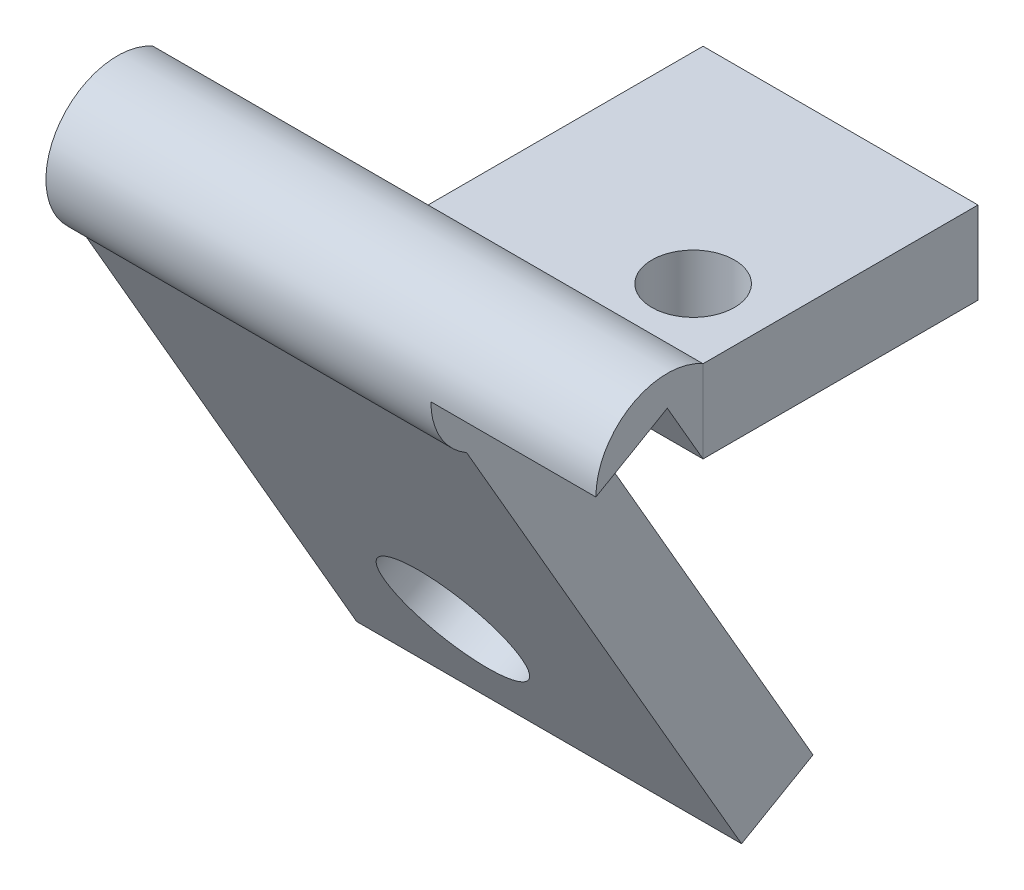
ISO-10303-21;
HEADER;
FILE_DESCRIPTION(('STEP AP214'),'2;1');
FILE_NAME('part.step','',(''),(''),'','','');
FILE_SCHEMA(('AUTOMOTIVE_DESIGN { 1 0 10303 214 1 1 1 1 }'));
ENDSEC;
DATA;
#1=APPLICATION_CONTEXT('core data for automotive mechanical design processes');
#2=APPLICATION_PROTOCOL_DEFINITION('international standard','automotive_design',2000,#1);
#3=PRODUCT_CONTEXT('',#1,'mechanical');
#4=PRODUCT('Part','Part','',(#3));
#5=PRODUCT_RELATED_PRODUCT_CATEGORY('part','',(#4));
#6=PRODUCT_DEFINITION_FORMATION('','',#4);
#7=PRODUCT_DEFINITION_CONTEXT('part definition',#1,'design');
#8=PRODUCT_DEFINITION('design','',#6,#7);
#9=PRODUCT_DEFINITION_SHAPE('','',#8);
#10=(LENGTH_UNIT() NAMED_UNIT(*) SI_UNIT(.MILLI.,.METRE.));
#11=(NAMED_UNIT(*) PLANE_ANGLE_UNIT() SI_UNIT($,.RADIAN.));
#12=(NAMED_UNIT(*) SI_UNIT($,.STERADIAN.) SOLID_ANGLE_UNIT());
#13=UNCERTAINTY_MEASURE_WITH_UNIT(LENGTH_MEASURE(1.E-05),#10,'distance_accuracy_value','');
#14=(GEOMETRIC_REPRESENTATION_CONTEXT(3) GLOBAL_UNCERTAINTY_ASSIGNED_CONTEXT((#13)) GLOBAL_UNIT_ASSIGNED_CONTEXT((#10,
#11,#12)) REPRESENTATION_CONTEXT('',''));
#15=CARTESIAN_POINT('',(0.,0.,0.));
#16=DIRECTION('',(0.,0.,1.));
#17=DIRECTION('',(1.,0.,0.));
#18=AXIS2_PLACEMENT_3D('',#15,#16,#17);
#19=CARTESIAN_POINT('',(-14.36,0.,7.22999999999998));
#20=DIRECTION('',(0.,0.,1.));
#21=DIRECTION('',(1.,0.,0.));
#22=AXIS2_PLACEMENT_3D('',#19,#20,#21);
#23=PLANE('',#22);
#24=DIRECTION('',(0.,-1.,0.));
#25=VECTOR('',#24,1.);
#26=CARTESIAN_POINT('',(5.63999999999998,0.,7.22999999999998));
#27=LINE('',#26,#25);
#28=CARTESIAN_POINT('',(5.63999999999998,3.,7.22999999999998));
#29=VERTEX_POINT('',#28);
#30=CARTESIAN_POINT('',(5.63999999999998,0.,7.22999999999998));
#31=VERTEX_POINT('',#30);
#32=EDGE_CURVE('E139',#29,#31,#27,.T.);
#33=ORIENTED_EDGE('',*,*,#32,.T.);
#34=DIRECTION('',(1.,0.,0.));
#35=VECTOR('',#34,1.);
#36=CARTESIAN_POINT('',(-14.36,0.,7.22999999999998));
#37=LINE('',#36,#35);
#38=CARTESIAN_POINT('',(-0.360000000000018,0.,7.22999999999998));
#39=VERTEX_POINT('',#38);
#40=EDGE_CURVE('E169',#39,#31,#37,.T.);
#41=ORIENTED_EDGE('',*,*,#40,.F.);
#42=DIRECTION('',(1.,0.,0.));
#43=VECTOR('',#42,1.);
#44=CARTESIAN_POINT('',(-14.36,0.,7.22999999999998));
#45=LINE('',#44,#43);
#46=CARTESIAN_POINT('',(-14.36,0.,7.22999999999998));
#47=VERTEX_POINT('',#46);
#48=EDGE_CURVE('E145',#47,#39,#45,.T.);
#49=ORIENTED_EDGE('',*,*,#48,.F.);
#50=DIRECTION('',(0.,-1.,0.));
#51=VECTOR('',#50,1.);
#52=CARTESIAN_POINT('',(-14.36,0.,7.22999999999998));
#53=LINE('',#52,#51);
#54=CARTESIAN_POINT('',(-14.36,3.,7.22999999999998));
#55=VERTEX_POINT('',#54);
#56=EDGE_CURVE('E134',#55,#47,#53,.T.);
#57=ORIENTED_EDGE('',*,*,#56,.F.);
#58=DIRECTION('',(1.,0.,0.));
#59=VECTOR('',#58,1.);
#60=CARTESIAN_POINT('',(-14.36,3.,7.22999999999998));
#61=LINE('',#60,#59);
#62=EDGE_CURVE('E86',#55,#29,#61,.T.);
#63=ORIENTED_EDGE('',*,*,#62,.T.);
#64=EDGE_LOOP('',(#33,#41,#49,#57,#63));
#65=FACE_BOUND('',#64,.T.);
#66=ADVANCED_FACE('F58',(#65),#23,.F.);
#67=CARTESIAN_POINT('',(-14.36,-3.13068183468073,5.4225));
#68=DIRECTION('',(0.,-0.499999999999998,0.86602540378444));
#69=DIRECTION('',(0.,-0.86602540378444,-0.499999999999998));
#70=AXIS2_PLACEMENT_3D('',#67,#68,#69);
#71=PLANE('',#70);
#72=CARTESIAN_POINT('',(-8.36000000000002,-12.9903810567666,-0.269999999999973));
#73=DIRECTION('',(0.,0.499999999999998,-0.86602540378444));
#74=DIRECTION('',(0.,0.86602540378444,0.499999999999998));
#75=AXIS2_PLACEMENT_3D('',#72,#73,#74);
#76=CIRCLE('',#75,2.5);
#77=CARTESIAN_POINT('',(-8.36000000000002,-10.8253175473055,0.980000000000023));
#78=VERTEX_POINT('',#77);
#79=EDGE_CURVE('E151',#78,#78,#76,.T.);
#80=ORIENTED_EDGE('',*,*,#79,.F.);
#81=EDGE_LOOP('',(#80));
#82=FACE_BOUND('',#81,.T.);
#83=ORIENTED_EDGE('',*,*,#48,.T.);
#84=DIRECTION('',(0.,0.86602540378444,0.499999999999998));
#85=VECTOR('',#84,1.);
#86=CARTESIAN_POINT('',(-0.360000000000018,-17.3205080756888,-2.76999999999996));
#87=LINE('',#86,#85);
#88=CARTESIAN_POINT('',(-0.360000000000018,-17.3205080756888,-2.76999999999996));
#89=VERTEX_POINT('',#88);
#90=EDGE_CURVE('E186',#89,#39,#87,.T.);
#91=ORIENTED_EDGE('',*,*,#90,.F.);
#92=DIRECTION('',(1.,0.,0.));
#93=VECTOR('',#92,1.);
#94=CARTESIAN_POINT('',(-14.36,-17.3205080756888,-2.76999999999996));
#95=LINE('',#94,#93);
#96=CARTESIAN_POINT('',(-14.36,-17.3205080756888,-2.76999999999996));
#97=VERTEX_POINT('',#96);
#98=EDGE_CURVE('E126',#97,#89,#95,.T.);
#99=ORIENTED_EDGE('',*,*,#98,.F.);
#100=DIRECTION('',(0.,-0.86602540378444,-0.499999999999998));
#101=VECTOR('',#100,1.);
#102=CARTESIAN_POINT('',(-14.36,-3.13068183468073,5.4225));
#103=LINE('',#102,#101);
#104=EDGE_CURVE('E74',#47,#97,#103,.T.);
#105=ORIENTED_EDGE('',*,*,#104,.F.);
#106=EDGE_LOOP('',(#83,#91,#99,#105));
#107=FACE_BOUND('',#106,.T.);
#108=ADVANCED_FACE('F183',(#82,#107),#71,.F.);
#109=CARTESIAN_POINT('',(-14.36,-14.1898262410081,-8.19249999999996));
#110=DIRECTION('',(0.,0.86602540378444,0.499999999999997));
#111=DIRECTION('',(0.,-0.499999999999997,0.86602540378444));
#112=AXIS2_PLACEMENT_3D('',#109,#110,#111);
#113=PLANE('',#112);
#114=ORIENTED_EDGE('',*,*,#98,.T.);
#115=DIRECTION('',(0.,0.499999999999998,-0.86602540378444));
#116=VECTOR('',#115,1.);
#117=CARTESIAN_POINT('',(-0.360000000000018,-22.3205080756887,5.89025403784444));
#118=LINE('',#117,#116);
#119=CARTESIAN_POINT('',(-0.360000000000018,-18.8205080756888,-0.171923788646639));
#120=VERTEX_POINT('',#119);
#121=EDGE_CURVE('E124',#120,#89,#118,.T.);
#122=ORIENTED_EDGE('',*,*,#121,.F.);
#123=DIRECTION('',(1.,0.,0.));
#124=VECTOR('',#123,1.);
#125=CARTESIAN_POINT('',(-14.36,-18.8205080756888,-0.171923788646644));
#126=LINE('',#125,#124);
#127=CARTESIAN_POINT('',(-14.36,-18.8205080756888,-0.171923788646644));
#128=VERTEX_POINT('',#127);
#129=EDGE_CURVE('E120',#128,#120,#126,.T.);
#130=ORIENTED_EDGE('',*,*,#129,.F.);
#131=DIRECTION('',(0.,-0.499999999999997,0.86602540378444));
#132=VECTOR('',#131,1.);
#133=CARTESIAN_POINT('',(-14.36,-14.1898262410081,-8.19249999999996));
#134=LINE('',#133,#132);
#135=EDGE_CURVE('E108',#97,#128,#134,.T.);
#136=ORIENTED_EDGE('',*,*,#135,.F.);
#137=EDGE_LOOP('',(#114,#122,#130,#136));
#138=FACE_BOUND('',#137,.T.);
#139=ADVANCED_FACE('F121',(#138),#113,.F.);
#140=CARTESIAN_POINT('',(-14.36,-4.63068183468072,8.02057621135332));
#141=DIRECTION('',(0.,0.499999999999998,-0.86602540378444));
#142=DIRECTION('',(0.,0.86602540378444,0.499999999999998));
#143=AXIS2_PLACEMENT_3D('',#140,#141,#142);
#144=PLANE('',#143);
#145=CARTESIAN_POINT('',(-8.36000000000002,-14.4903810567666,2.32807621135335));
#146=DIRECTION('',(0.,0.499999999999998,-0.86602540378444));
#147=DIRECTION('',(0.,0.86602540378444,0.499999999999998));
#148=AXIS2_PLACEMENT_3D('',#145,#146,#147);
#149=CIRCLE('',#148,2.5);
#150=CARTESIAN_POINT('',(-8.36000000000002,-12.3253175473055,3.57807621135334));
#151=VERTEX_POINT('',#150);
#152=EDGE_CURVE('E142',#151,#151,#149,.T.);
#153=ORIENTED_EDGE('',*,*,#152,.T.);
#154=EDGE_LOOP('',(#153));
#155=FACE_BOUND('',#154,.T.);
#156=ORIENTED_EDGE('',*,*,#129,.T.);
#157=DIRECTION('',(0.,0.86602540378444,0.499999999999998));
#158=VECTOR('',#157,1.);
#159=CARTESIAN_POINT('',(-0.360000000000018,-4.63068183468072,8.02057621135332));
#160=LINE('',#159,#158);
#161=CARTESIAN_POINT('',(-0.360000000000018,-1.49999999999996,9.82807621135333));
#162=VERTEX_POINT('',#161);
#163=EDGE_CURVE('E168',#120,#162,#160,.T.);
#164=ORIENTED_EDGE('',*,*,#163,.T.);
#165=DIRECTION('',(1.,0.,0.));
#166=VECTOR('',#165,1.);
#167=CARTESIAN_POINT('',(-14.36,-1.49999999999995,9.82807621135332));
#168=LINE('',#167,#166);
#169=CARTESIAN_POINT('',(-14.36,-1.49999999999995,9.82807621135332));
#170=VERTEX_POINT('',#169);
#171=EDGE_CURVE('E127',#170,#162,#168,.T.);
#172=ORIENTED_EDGE('',*,*,#171,.F.);
#173=DIRECTION('',(0.,0.86602540378444,0.499999999999998));
#174=VECTOR('',#173,1.);
#175=CARTESIAN_POINT('',(-14.36,-4.63068183468072,8.02057621135332));
#176=LINE('',#175,#174);
#177=EDGE_CURVE('E113',#128,#170,#176,.T.);
#178=ORIENTED_EDGE('',*,*,#177,.F.);
#179=EDGE_LOOP('',(#156,#164,#172,#178));
#180=FACE_BOUND('',#179,.T.);
#181=ADVANCED_FACE('F129',(#155,#180),#144,.F.);
#182=CARTESIAN_POINT('',(-14.36,0.750000000000003,8.52903810567664));
#183=DIRECTION('',(1.,0.,0.));
#184=DIRECTION('',(0.,0.,-1.));
#185=AXIS2_PLACEMENT_3D('',#182,#183,#184);
#186=CYLINDRICAL_SURFACE('',#185,2.5980762113533);
#187=DIRECTION('',(1.,0.,0.));
#188=VECTOR('',#187,1.);
#189=CARTESIAN_POINT('',(-14.36,0.750000000000021,11.1271143170299));
#190=LINE('',#189,#188);
#191=CARTESIAN_POINT('',(5.63999999999998,0.750000000000022,11.1271143170299));
#192=VERTEX_POINT('',#191);
#193=CARTESIAN_POINT('',(-0.360000000000018,0.750000000000021,11.1271143170299));
#194=VERTEX_POINT('',#193);
#195=EDGE_CURVE('E159',#192,#194,#190,.F.);
#196=ORIENTED_EDGE('',*,*,#195,.F.);
#197=CARTESIAN_POINT('',(5.63999999999998,0.750000000000003,8.52903810567664));
#198=DIRECTION('',(1.,0.,0.));
#199=DIRECTION('',(0.,0.,-1.));
#200=AXIS2_PLACEMENT_3D('',#197,#198,#199);
#201=CIRCLE('',#200,2.5980762113533);
#202=EDGE_CURVE('E141',#29,#192,#201,.T.);
#203=ORIENTED_EDGE('',*,*,#202,.F.);
#204=ORIENTED_EDGE('',*,*,#62,.F.);
#205=CARTESIAN_POINT('',(-14.36,0.750000000000003,8.52903810567664));
#206=DIRECTION('',(1.,0.,0.));
#207=DIRECTION('',(0.,0.,-1.));
#208=AXIS2_PLACEMENT_3D('',#205,#206,#207);
#209=CIRCLE('',#208,2.5980762113533);
#210=EDGE_CURVE('E132',#55,#170,#209,.T.);
#211=ORIENTED_EDGE('',*,*,#210,.T.);
#212=ORIENTED_EDGE('',*,*,#171,.T.);
#213=CARTESIAN_POINT('',(-0.360000000000018,0.750000000000003,8.52903810567664));
#214=DIRECTION('',(-1.,0.,0.));
#215=DIRECTION('',(0.,0.,1.));
#216=AXIS2_PLACEMENT_3D('',#213,#214,#215);
#217=CIRCLE('',#216,2.5980762113533);
#218=EDGE_CURVE('E13',#194,#162,#217,.F.);
#219=ORIENTED_EDGE('',*,*,#218,.F.);
#220=EDGE_LOOP('',(#196,#203,#204,#211,#212,#219));
#221=FACE_BOUND('',#220,.T.);
#222=ADVANCED_FACE('F167',(#221),#186,.T.);
#223=CARTESIAN_POINT('',(-14.36,0.,0.));
#224=DIRECTION('',(1.,0.,0.));
#225=DIRECTION('',(0.,0.,-1.));
#226=AXIS2_PLACEMENT_3D('',#223,#224,#225);
#227=PLANE('',#226);
#228=ORIENTED_EDGE('',*,*,#56,.T.);
#229=ORIENTED_EDGE('',*,*,#104,.T.);
#230=ORIENTED_EDGE('',*,*,#135,.T.);
#231=ORIENTED_EDGE('',*,*,#177,.T.);
#232=ORIENTED_EDGE('',*,*,#210,.F.);
#233=EDGE_LOOP('',(#228,#229,#230,#231,#232));
#234=FACE_BOUND('',#233,.T.);
#235=ADVANCED_FACE('F110',(#234),#227,.F.);
#236=CARTESIAN_POINT('',(5.63999999999998,0.,0.));
#237=DIRECTION('',(1.,0.,0.));
#238=DIRECTION('',(0.,0.,-1.));
#239=AXIS2_PLACEMENT_3D('',#236,#237,#238);
#240=PLANE('',#239);
#241=DIRECTION('',(0.,-0.499999999999998,0.86602540378444));
#242=VECTOR('',#241,1.);
#243=CARTESIAN_POINT('',(5.63999999999998,5.38068183468073,3.10653810567663));
#244=LINE('',#243,#242);
#245=CARTESIAN_POINT('',(5.63999999999998,2.25000000000001,8.52903810567663));
#246=VERTEX_POINT('',#245);
#247=EDGE_CURVE('E66',#246,#192,#244,.T.);
#248=ORIENTED_EDGE('',*,*,#247,.F.);
#249=DIRECTION('',(0.,-0.86602540378444,-0.499999999999998));
#250=VECTOR('',#249,1.);
#251=CARTESIAN_POINT('',(5.63999999999998,-17.3205080756888,-2.76999999999996));
#252=LINE('',#251,#250);
#253=EDGE_CURVE('E173',#246,#31,#252,.T.);
#254=ORIENTED_EDGE('',*,*,#253,.T.);
#255=ORIENTED_EDGE('',*,*,#32,.F.);
#256=ORIENTED_EDGE('',*,*,#202,.T.);
#257=EDGE_LOOP('',(#248,#254,#255,#256));
#258=FACE_BOUND('',#257,.T.);
#259=ADVANCED_FACE('F171',(#258),#240,.T.);
#260=CARTESIAN_POINT('',(-8.36000000000002,-17.9903810567666,8.39025403784443));
#261=DIRECTION('',(0.,0.499999999999998,-0.86602540378444));
#262=DIRECTION('',(0.,0.86602540378444,0.499999999999998));
#263=AXIS2_PLACEMENT_3D('',#260,#261,#262);
#264=CYLINDRICAL_SURFACE('',#263,2.5);
#265=CARTESIAN_POINT('',(-8.36000000000002,-10.8253175473055,0.980000000000023));
#266=CARTESIAN_POINT('',(-8.36000000000002,-10.8409425473055,1.00706329386829));
#267=CARTESIAN_POINT('',(-8.36000000000002,-10.8565675473055,1.03412658773655));
#268=CARTESIAN_POINT('',(-8.36000000000002,-10.8878175473055,1.08825317547308));
#269=CARTESIAN_POINT('',(-8.36000000000002,-10.9034425473055,1.11531646934134));
#270=CARTESIAN_POINT('',(-8.36000000000002,-10.9346925473055,1.16944305707787));
#271=CARTESIAN_POINT('',(-8.36000000000002,-10.9503175473055,1.19650635094613));
#272=CARTESIAN_POINT('',(-8.36000000000002,-10.9815675473055,1.25063293868266));
#273=CARTESIAN_POINT('',(-8.36000000000002,-10.9971925473055,1.27769623255092));
#274=CARTESIAN_POINT('',(-8.36000000000002,-11.0284425473055,1.33182282028745));
#275=CARTESIAN_POINT('',(-8.36000000000002,-11.0440675473055,1.35888611415571));
#276=CARTESIAN_POINT('',(-8.36000000000002,-11.0753175473055,1.41301270189224));
#277=CARTESIAN_POINT('',(-8.36000000000002,-11.0909425473055,1.44007599576051));
#278=CARTESIAN_POINT('',(-8.36000000000002,-11.1221925473055,1.49420258349703));
#279=CARTESIAN_POINT('',(-8.36000000000002,-11.1378175473055,1.5212658773653));
#280=CARTESIAN_POINT('',(-8.36000000000002,-11.1690675473055,1.57539246510182));
#281=CARTESIAN_POINT('',(-8.36000000000002,-11.1846925473055,1.60245575897009));
#282=CARTESIAN_POINT('',(-8.36000000000002,-11.2159425473055,1.65658234670662));
#283=CARTESIAN_POINT('',(-8.36000000000002,-11.2315675473055,1.68364564057488));
#284=CARTESIAN_POINT('',(-8.36000000000002,-11.2628175473055,1.73777222831141));
#285=CARTESIAN_POINT('',(-8.36000000000002,-11.2784425473055,1.76483552217967));
#286=CARTESIAN_POINT('',(-8.36000000000002,-11.3096925473055,1.8189621099162));
#287=CARTESIAN_POINT('',(-8.36000000000002,-11.3253175473055,1.84602540378446));
#288=CARTESIAN_POINT('',(-8.36000000000002,-11.3565675473055,1.90015199152099));
#289=CARTESIAN_POINT('',(-8.36000000000002,-11.3721925473055,1.92721528538925));
#290=CARTESIAN_POINT('',(-8.36000000000002,-11.4034425473055,1.98134187312578));
#291=CARTESIAN_POINT('',(-8.36000000000002,-11.4190675473055,2.00840516699404));
#292=CARTESIAN_POINT('',(-8.36000000000002,-11.4503175473055,2.06253175473057));
#293=CARTESIAN_POINT('',(-8.36000000000002,-11.4659425473055,2.08959504859884));
#294=CARTESIAN_POINT('',(-8.36000000000002,-11.4971925473055,2.14372163633536));
#295=CARTESIAN_POINT('',(-8.36000000000002,-11.5128175473055,2.17078493020363));
#296=CARTESIAN_POINT('',(-8.36000000000002,-11.5440675473055,2.22491151794015));
#297=CARTESIAN_POINT('',(-8.36000000000002,-11.5596925473055,2.25197481180842));
#298=CARTESIAN_POINT('',(-8.36000000000002,-11.5909425473055,2.30610139954494));
#299=CARTESIAN_POINT('',(-8.36000000000002,-11.6065675473055,2.33316469341321));
#300=CARTESIAN_POINT('',(-8.36000000000002,-11.6378175473055,2.38729128114974));
#301=CARTESIAN_POINT('',(-8.36000000000002,-11.6534425473055,2.414354575018));
#302=CARTESIAN_POINT('',(-8.36000000000002,-11.6846925473055,2.46848116275453));
#303=CARTESIAN_POINT('',(-8.36000000000002,-11.7003175473055,2.49554445662279));
#304=CARTESIAN_POINT('',(-8.36000000000002,-11.7315675473055,2.54967104435932));
#305=CARTESIAN_POINT('',(-8.36000000000002,-11.7471925473055,2.57673433822758));
#306=CARTESIAN_POINT('',(-8.36000000000002,-11.7784425473055,2.63086092596411));
#307=CARTESIAN_POINT('',(-8.36000000000002,-11.7940675473055,2.65792421983237));
#308=CARTESIAN_POINT('',(-8.36000000000002,-11.8253175473055,2.7120508075689));
#309=CARTESIAN_POINT('',(-8.36000000000002,-11.8409425473055,2.73911410143716));
#310=CARTESIAN_POINT('',(-8.36000000000002,-11.8721925473055,2.79324068917369));
#311=CARTESIAN_POINT('',(-8.36000000000002,-11.8878175473055,2.82030398304196));
#312=CARTESIAN_POINT('',(-8.36000000000002,-11.9190675473055,2.87443057077848));
#313=CARTESIAN_POINT('',(-8.36000000000002,-11.9346925473055,2.90149386464675));
#314=CARTESIAN_POINT('',(-8.36000000000002,-11.9659425473055,2.95562045238327));
#315=CARTESIAN_POINT('',(-8.36000000000002,-11.9815675473055,2.98268374625154));
#316=CARTESIAN_POINT('',(-8.36000000000002,-12.0128175473055,3.03681033398807));
#317=CARTESIAN_POINT('',(-8.36000000000002,-12.0284425473055,3.06387362785633));
#318=CARTESIAN_POINT('',(-8.36000000000002,-12.0596925473055,3.11800021559286));
#319=CARTESIAN_POINT('',(-8.36000000000002,-12.0753175473055,3.14506350946112));
#320=CARTESIAN_POINT('',(-8.36000000000002,-12.1065675473055,3.19919009719765));
#321=CARTESIAN_POINT('',(-8.36000000000002,-12.1221925473055,3.22625339106591));
#322=CARTESIAN_POINT('',(-8.36000000000002,-12.1534425473055,3.28037997880244));
#323=CARTESIAN_POINT('',(-8.36000000000002,-12.1690675473055,3.3074432726707));
#324=CARTESIAN_POINT('',(-8.36000000000002,-12.2003175473055,3.36156986040723));
#325=CARTESIAN_POINT('',(-8.36000000000002,-12.2159425473055,3.38863315427549));
#326=CARTESIAN_POINT('',(-8.36000000000002,-12.2471925473055,3.44275974201202));
#327=CARTESIAN_POINT('',(-8.36000000000002,-12.2628175473055,3.46982303588028));
#328=CARTESIAN_POINT('',(-8.36000000000002,-12.2940675473055,3.52394962361681));
#329=CARTESIAN_POINT('',(-8.36000000000002,-12.3096925473055,3.55101291748508));
#330=CARTESIAN_POINT('',(-8.36000000000002,-12.3253175473055,3.57807621135334));
#331=B_SPLINE_CURVE_WITH_KNOTS('',3,(#265,#266,#267,#268,#269,#270,#271,#272,#273,#274,#275,
#276,#277,#278,#279,#280,#281,#282,#283,#284,#285,#286,#287,#288,#289,#290,#291,#292,#293,#294,
#295,#296,#297,#298,#299,#300,#301,#302,#303,#304,#305,#306,#307,#308,#309,#310,#311,#312,#313,
#314,#315,#316,#317,#318,#319,#320,#321,#322,#323,#324,#325,#326,#327,#328,#329,#330),
.UNSPECIFIED.,.F.,.F.,(4,2,2,2,2,2,2,2,2,2,2,2,2,2,2,2,2,2,2,2,2,2,2,2,2,2,2,2,2,2,2,2,4),(0.,
0.0937499999999995,0.187500000000001,0.28125,0.375000000000001,0.468749999999999,
0.562499999999997,0.656249999999999,0.749999999999998,0.843749999999998,0.937499999999999,
1.03125,1.125,1.21875,1.3125,1.40625,1.5,1.59375,1.6875,1.78125,1.875,1.96875,2.0625,2.15625,
2.25,2.34375,2.4375,2.53125,2.625,2.71875,2.8125,2.90625,3.),.UNSPECIFIED.);
#332=EDGE_CURVE('BSEAM201',#78,#151,#331,.T.);
#333=ORIENTED_EDGE('',*,*,#79,.T.);
#334=ORIENTED_EDGE('',*,*,#152,.F.);
#335=ORIENTED_EDGE('',*,*,#332,.T.);
#336=ORIENTED_EDGE('',*,*,#332,.F.);
#337=EDGE_LOOP('',(#333,#335,#334,#336));
#338=FACE_BOUND('',#337,.T.);
#339=ADVANCED_FACE('F201',(#338),#264,.F.);
#340=CARTESIAN_POINT('',(-0.360000000000018,-22.3205080756887,5.89025403784444));
#341=DIRECTION('',(-1.,0.,0.));
#342=DIRECTION('',(0.,0.,1.));
#343=AXIS2_PLACEMENT_3D('',#340,#341,#342);
#344=PLANE('',#343);
#345=ORIENTED_EDGE('',*,*,#121,.T.);
#346=ORIENTED_EDGE('',*,*,#90,.T.);
#347=CARTESIAN_POINT('',(-0.360000000000018,2.25000000000001,8.52903810567663));
#348=VERTEX_POINT('',#347);
#349=EDGE_CURVE('E190',#39,#348,#87,.T.);
#350=ORIENTED_EDGE('',*,*,#349,.T.);
#351=DIRECTION('',(0.,0.499999999999998,-0.86602540378444));
#352=VECTOR('',#351,1.);
#353=CARTESIAN_POINT('',(-0.360000000000018,-2.74999999999997,17.189292143521));
#354=LINE('',#353,#352);
#355=EDGE_CURVE('E180',#194,#348,#354,.T.);
#356=ORIENTED_EDGE('',*,*,#355,.F.);
#357=ORIENTED_EDGE('',*,*,#218,.T.);
#358=ORIENTED_EDGE('',*,*,#163,.F.);
#359=EDGE_LOOP('',(#345,#346,#350,#356,#357,#358));
#360=FACE_BOUND('',#359,.T.);
#361=ADVANCED_FACE('F226',(#360),#344,.F.);
#362=CARTESIAN_POINT('',(0.,-3.13068183468073,5.4225));
#363=DIRECTION('',(0.,-0.499999999999998,0.86602540378444));
#364=DIRECTION('',(0.,-0.86602540378444,-0.499999999999998));
#365=AXIS2_PLACEMENT_3D('',#362,#363,#364);
#366=PLANE('',#365);
#367=ORIENTED_EDGE('',*,*,#40,.T.);
#368=ORIENTED_EDGE('',*,*,#253,.F.);
#369=DIRECTION('',(1.,0.,0.));
#370=VECTOR('',#369,1.);
#371=CARTESIAN_POINT('',(5.63999999999998,2.25000000000001,8.52903810567663));
#372=LINE('',#371,#370);
#373=EDGE_CURVE('E162',#348,#246,#372,.T.);
#374=ORIENTED_EDGE('',*,*,#373,.F.);
#375=ORIENTED_EDGE('',*,*,#349,.F.);
#376=EDGE_LOOP('',(#367,#368,#374,#375));
#377=FACE_BOUND('',#376,.T.);
#378=ADVANCED_FACE('F229',(#377),#366,.T.);
#379=CARTESIAN_POINT('',(5.63999999999998,-2.74999999999997,17.189292143521));
#380=DIRECTION('',(0.,0.86602540378444,0.499999999999998));
#381=DIRECTION('',(0.,-0.499999999999998,0.86602540378444));
#382=AXIS2_PLACEMENT_3D('',#379,#380,#381);
#383=PLANE('',#382);
#384=ORIENTED_EDGE('',*,*,#195,.T.);
#385=ORIENTED_EDGE('',*,*,#355,.T.);
#386=ORIENTED_EDGE('',*,*,#373,.T.);
#387=ORIENTED_EDGE('',*,*,#247,.T.);
#388=EDGE_LOOP('',(#384,#385,#386,#387));
#389=FACE_BOUND('',#388,.T.);
#390=ADVANCED_FACE('F157',(#389),#383,.F.);
#391=CLOSED_SHELL('',(#66,#108,#139,#181,#222,#235,#259,#339,#361,#378,#390));
#392=MANIFOLD_SOLID_BREP('B2',#391);
#393=CARTESIAN_POINT('',(0.,3.,0.));
#394=DIRECTION('',(0.,1.,0.));
#395=DIRECTION('',(0.,0.,1.));
#396=AXIS2_PLACEMENT_3D('',#393,#394,#395);
#397=PLANE('',#396);
#398=DIRECTION('',(1.,0.,0.));
#399=VECTOR('',#398,1.);
#400=CARTESIAN_POINT('',(-4.36000000000002,3.,-2.77000000000002));
#401=LINE('',#400,#399);
#402=CARTESIAN_POINT('',(-4.36000000000002,3.,-2.77000000000002));
#403=VERTEX_POINT('',#402);
#404=CARTESIAN_POINT('',(5.63999999999998,3.,-2.77000000000002));
#405=VERTEX_POINT('',#404);
#406=EDGE_CURVE('E365',#403,#405,#401,.T.);
#407=ORIENTED_EDGE('',*,*,#406,.F.);
#408=DIRECTION('',(0.,0.,-1.));
#409=VECTOR('',#408,1.);
#410=CARTESIAN_POINT('',(-4.36000000000002,3.,7.22999999999998));
#411=LINE('',#410,#409);
#412=CARTESIAN_POINT('',(-4.36000000000002,3.,7.22999999999998));
#413=VERTEX_POINT('',#412);
#414=EDGE_CURVE('E355',#413,#403,#411,.T.);
#415=ORIENTED_EDGE('',*,*,#414,.F.);
#416=DIRECTION('',(1.,0.,0.));
#417=VECTOR('',#416,1.);
#418=CARTESIAN_POINT('',(-4.36000000000002,3.,7.22999999999998));
#419=LINE('',#418,#417);
#420=CARTESIAN_POINT('',(5.63999999999998,3.,7.22999999999998));
#421=VERTEX_POINT('',#420);
#422=EDGE_CURVE('E352',#413,#421,#419,.T.);
#423=ORIENTED_EDGE('',*,*,#422,.T.);
#424=DIRECTION('',(0.,0.,-1.));
#425=VECTOR('',#424,1.);
#426=CARTESIAN_POINT('',(5.63999999999998,3.,7.22999999999998));
#427=LINE('',#426,#425);
#428=EDGE_CURVE('E349',#421,#405,#427,.T.);
#429=ORIENTED_EDGE('',*,*,#428,.T.);
#430=EDGE_LOOP('',(#407,#415,#423,#429));
#431=FACE_BOUND('',#430,.T.);
#432=CARTESIAN_POINT('',(2.94,3.,4.88999999999999));
#433=DIRECTION('',(0.,1.,0.));
#434=DIRECTION('',(0.,0.,1.));
#435=AXIS2_PLACEMENT_3D('',#432,#433,#434);
#436=CIRCLE('',#435,1.5);
#437=CARTESIAN_POINT('',(2.94,3.,6.38999999999999));
#438=VERTEX_POINT('',#437);
#439=EDGE_CURVE('E376',#438,#438,#436,.T.);
#440=ORIENTED_EDGE('',*,*,#439,.F.);
#441=EDGE_LOOP('',(#440));
#442=FACE_BOUND('',#441,.T.);
#443=ADVANCED_FACE('F306',(#431,#442),#397,.T.);
#444=CARTESIAN_POINT('',(0.,0.,0.));
#445=DIRECTION('',(0.,1.,0.));
#446=DIRECTION('',(0.,0.,1.));
#447=AXIS2_PLACEMENT_3D('',#444,#445,#446);
#448=PLANE('',#447);
#449=DIRECTION('',(1.,0.,0.));
#450=VECTOR('',#449,1.);
#451=CARTESIAN_POINT('',(-4.36000000000002,0.,-2.77000000000002));
#452=LINE('',#451,#450);
#453=CARTESIAN_POINT('',(-4.36000000000002,0.,-2.77000000000002));
#454=VERTEX_POINT('',#453);
#455=CARTESIAN_POINT('',(5.63999999999998,0.,-2.77000000000002));
#456=VERTEX_POINT('',#455);
#457=EDGE_CURVE('E372',#454,#456,#452,.T.);
#458=ORIENTED_EDGE('',*,*,#457,.T.);
#459=DIRECTION('',(0.,0.,-1.));
#460=VECTOR('',#459,1.);
#461=CARTESIAN_POINT('',(5.63999999999998,0.,7.22999999999998));
#462=LINE('',#461,#460);
#463=CARTESIAN_POINT('',(5.63999999999998,0.,7.22999999999998));
#464=VERTEX_POINT('',#463);
#465=EDGE_CURVE('E375',#464,#456,#462,.T.);
#466=ORIENTED_EDGE('',*,*,#465,.F.);
#467=DIRECTION('',(1.,0.,0.));
#468=VECTOR('',#467,1.);
#469=CARTESIAN_POINT('',(-4.36000000000002,0.,7.22999999999998));
#470=LINE('',#469,#468);
#471=CARTESIAN_POINT('',(-4.36000000000002,0.,7.22999999999998));
#472=VERTEX_POINT('',#471);
#473=EDGE_CURVE('E360',#472,#464,#470,.T.);
#474=ORIENTED_EDGE('',*,*,#473,.F.);
#475=DIRECTION('',(0.,0.,-1.));
#476=VECTOR('',#475,1.);
#477=CARTESIAN_POINT('',(-4.36000000000002,0.,7.22999999999998));
#478=LINE('',#477,#476);
#479=EDGE_CURVE('E367',#472,#454,#478,.T.);
#480=ORIENTED_EDGE('',*,*,#479,.T.);
#481=EDGE_LOOP('',(#458,#466,#474,#480));
#482=FACE_BOUND('',#481,.T.);
#483=CARTESIAN_POINT('',(2.94,0.,4.88999999999999));
#484=DIRECTION('',(0.,1.,0.));
#485=DIRECTION('',(0.,0.,1.));
#486=AXIS2_PLACEMENT_3D('',#483,#484,#485);
#487=CIRCLE('',#486,1.5);
#488=CARTESIAN_POINT('',(2.94,0.,6.38999999999999));
#489=VERTEX_POINT('',#488);
#490=EDGE_CURVE('E410',#489,#489,#487,.T.);
#491=ORIENTED_EDGE('',*,*,#490,.T.);
#492=EDGE_LOOP('',(#491));
#493=FACE_BOUND('',#492,.T.);
#494=ADVANCED_FACE('F382',(#482,#493),#448,.F.);
#495=CARTESIAN_POINT('',(-4.36000000000002,3.,-2.77000000000002));
#496=DIRECTION('',(0.,0.,-1.));
#497=DIRECTION('',(-1.,0.,0.));
#498=AXIS2_PLACEMENT_3D('',#495,#496,#497);
#499=PLANE('',#498);
#500=ORIENTED_EDGE('',*,*,#457,.F.);
#501=DIRECTION('',(0.,-1.,0.));
#502=VECTOR('',#501,1.);
#503=CARTESIAN_POINT('',(-4.36000000000002,3.,-2.77000000000002));
#504=LINE('',#503,#502);
#505=EDGE_CURVE('E56',#403,#454,#504,.T.);
#506=ORIENTED_EDGE('',*,*,#505,.F.);
#507=ORIENTED_EDGE('',*,*,#406,.T.);
#508=DIRECTION('',(0.,-1.,0.));
#509=VECTOR('',#508,1.);
#510=CARTESIAN_POINT('',(5.63999999999998,3.,-2.77000000000002));
#511=LINE('',#510,#509);
#512=EDGE_CURVE('E310',#405,#456,#511,.T.);
#513=ORIENTED_EDGE('',*,*,#512,.T.);
#514=EDGE_LOOP('',(#500,#506,#507,#513));
#515=FACE_BOUND('',#514,.T.);
#516=ADVANCED_FACE('F308',(#515),#499,.T.);
#517=CARTESIAN_POINT('',(-4.36000000000002,3.,7.22999999999998));
#518=DIRECTION('',(-1.,0.,0.));
#519=DIRECTION('',(0.,0.,1.));
#520=AXIS2_PLACEMENT_3D('',#517,#518,#519);
#521=PLANE('',#520);
#522=ORIENTED_EDGE('',*,*,#479,.F.);
#523=DIRECTION('',(0.,-1.,0.));
#524=VECTOR('',#523,1.);
#525=CARTESIAN_POINT('',(-4.36000000000002,3.,7.22999999999998));
#526=LINE('',#525,#524);
#527=EDGE_CURVE('E316',#413,#472,#526,.T.);
#528=ORIENTED_EDGE('',*,*,#527,.F.);
#529=ORIENTED_EDGE('',*,*,#414,.T.);
#530=ORIENTED_EDGE('',*,*,#505,.T.);
#531=EDGE_LOOP('',(#522,#528,#529,#530));
#532=FACE_BOUND('',#531,.T.);
#533=ADVANCED_FACE('F384',(#532),#521,.T.);
#534=CARTESIAN_POINT('',(-4.36000000000002,3.,7.22999999999998));
#535=DIRECTION('',(0.,0.,-1.));
#536=DIRECTION('',(-1.,0.,0.));
#537=AXIS2_PLACEMENT_3D('',#534,#535,#536);
#538=PLANE('',#537);
#539=ORIENTED_EDGE('',*,*,#473,.T.);
#540=DIRECTION('',(0.,-1.,0.));
#541=VECTOR('',#540,1.);
#542=CARTESIAN_POINT('',(5.63999999999998,3.,7.22999999999998));
#543=LINE('',#542,#541);
#544=EDGE_CURVE('E358',#421,#464,#543,.T.);
#545=ORIENTED_EDGE('',*,*,#544,.F.);
#546=ORIENTED_EDGE('',*,*,#422,.F.);
#547=ORIENTED_EDGE('',*,*,#527,.T.);
#548=EDGE_LOOP('',(#539,#545,#546,#547));
#549=FACE_BOUND('',#548,.T.);
#550=ADVANCED_FACE('F359',(#549),#538,.F.);
#551=CARTESIAN_POINT('',(5.63999999999998,3.,7.22999999999998));
#552=DIRECTION('',(-1.,0.,0.));
#553=DIRECTION('',(0.,0.,1.));
#554=AXIS2_PLACEMENT_3D('',#551,#552,#553);
#555=PLANE('',#554);
#556=ORIENTED_EDGE('',*,*,#465,.T.);
#557=ORIENTED_EDGE('',*,*,#512,.F.);
#558=ORIENTED_EDGE('',*,*,#428,.F.);
#559=ORIENTED_EDGE('',*,*,#544,.T.);
#560=EDGE_LOOP('',(#556,#557,#558,#559));
#561=FACE_BOUND('',#560,.T.);
#562=ADVANCED_FACE('F364',(#561),#555,.F.);
#563=CARTESIAN_POINT('',(2.94,3.,4.88999999999999));
#564=DIRECTION('',(0.,-1.,0.));
#565=DIRECTION('',(0.,0.,-1.));
#566=AXIS2_PLACEMENT_3D('',#563,#564,#565);
#567=CYLINDRICAL_SURFACE('',#566,1.5);
#568=ORIENTED_EDGE('',*,*,#439,.T.);
#569=EDGE_LOOP('',(#568));
#570=FACE_BOUND('',#569,.T.);
#571=ORIENTED_EDGE('',*,*,#490,.F.);
#572=EDGE_LOOP('',(#571));
#573=FACE_BOUND('',#572,.T.);
#574=ADVANCED_FACE('F399',(#570,#573),#567,.F.);
#575=CLOSED_SHELL('',(#443,#494,#516,#533,#550,#562,#574));
#576=MANIFOLD_SOLID_BREP('B7',#575);
#577=ADVANCED_BREP_SHAPE_REPRESENTATION('',(#18,#392,#576),#14);
#578=SHAPE_DEFINITION_REPRESENTATION(#9,#577);
ENDSEC;
END-ISO-10303-21;
